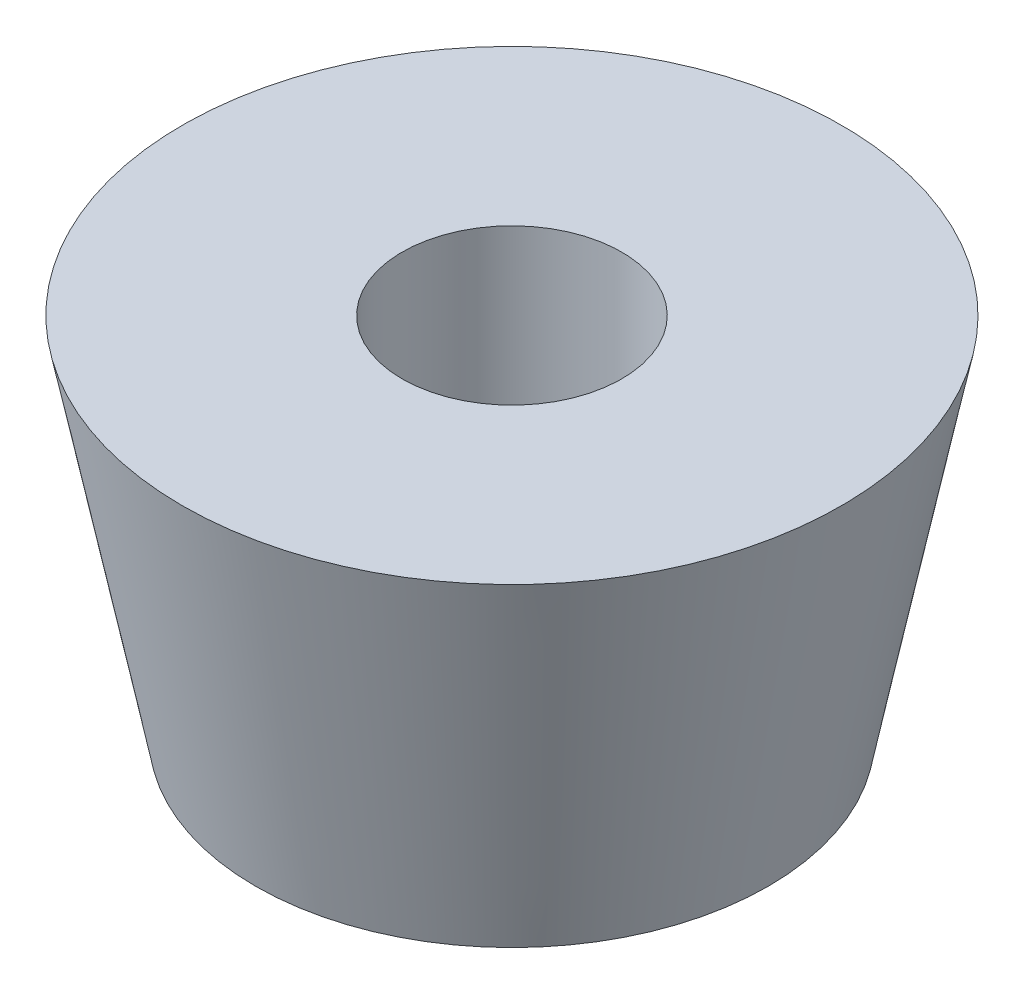
ISO-10303-21;
HEADER;
FILE_DESCRIPTION(('STEP AP214'),'2;1');
FILE_NAME('part.step','',(''),(''),'','','');
FILE_SCHEMA(('AUTOMOTIVE_DESIGN { 1 0 10303 214 1 1 1 1 }'));
ENDSEC;
DATA;
#1=APPLICATION_CONTEXT('core data for automotive mechanical design processes');
#2=APPLICATION_PROTOCOL_DEFINITION('international standard','automotive_design',2000,#1);
#3=PRODUCT_CONTEXT('',#1,'mechanical');
#4=PRODUCT('Part','Part','',(#3));
#5=PRODUCT_RELATED_PRODUCT_CATEGORY('part','',(#4));
#6=PRODUCT_DEFINITION_FORMATION('','',#4);
#7=PRODUCT_DEFINITION_CONTEXT('part definition',#1,'design');
#8=PRODUCT_DEFINITION('design','',#6,#7);
#9=PRODUCT_DEFINITION_SHAPE('','',#8);
#10=(LENGTH_UNIT() NAMED_UNIT(*) SI_UNIT(.MILLI.,.METRE.));
#11=(NAMED_UNIT(*) PLANE_ANGLE_UNIT() SI_UNIT($,.RADIAN.));
#12=(NAMED_UNIT(*) SI_UNIT($,.STERADIAN.) SOLID_ANGLE_UNIT());
#13=UNCERTAINTY_MEASURE_WITH_UNIT(LENGTH_MEASURE(1.E-05),#10,'distance_accuracy_value','');
#14=(GEOMETRIC_REPRESENTATION_CONTEXT(3) GLOBAL_UNCERTAINTY_ASSIGNED_CONTEXT((#13)) GLOBAL_UNIT_ASSIGNED_CONTEXT((#10,
#11,#12)) REPRESENTATION_CONTEXT('',''));
#15=CARTESIAN_POINT('',(0.,0.,0.));
#16=DIRECTION('',(0.,0.,1.));
#17=DIRECTION('',(1.,0.,0.));
#18=AXIS2_PLACEMENT_3D('',#15,#16,#17);
#19=CARTESIAN_POINT('',(0.,0.,-4.5));
#20=DIRECTION('',(0.,-1.,0.));
#21=DIRECTION('',(0.,0.,-1.));
#22=AXIS2_PLACEMENT_3D('',#19,#20,#21);
#23=PLANE('',#22);
#24=CARTESIAN_POINT('',(0.,0.,0.));
#25=DIRECTION('',(0.,1.,0.));
#26=DIRECTION('',(0.,0.,1.));
#27=AXIS2_PLACEMENT_3D('',#24,#25,#26);
#28=CIRCLE('',#27,1.5);
#29=CARTESIAN_POINT('',(0.,0.,1.5));
#30=VERTEX_POINT('',#29);
#31=EDGE_CURVE('E10',#30,#30,#28,.T.);
#32=ORIENTED_EDGE('',*,*,#31,.F.);
#33=EDGE_LOOP('',(#32));
#34=FACE_BOUND('',#33,.T.);
#35=CARTESIAN_POINT('',(0.,0.,0.));
#36=DIRECTION('',(0.,1.,0.));
#37=DIRECTION('',(0.,0.,1.));
#38=AXIS2_PLACEMENT_3D('',#35,#36,#37);
#39=CIRCLE('',#38,4.5);
#40=CARTESIAN_POINT('',(0.,0.,4.5));
#41=VERTEX_POINT('',#40);
#42=EDGE_CURVE('E45',#41,#41,#39,.T.);
#43=ORIENTED_EDGE('',*,*,#42,.T.);
#44=EDGE_LOOP('',(#43));
#45=FACE_BOUND('',#44,.T.);
#46=ADVANCED_FACE('F31',(#34,#45),#23,.F.);
#47=CARTESIAN_POINT('',(0.,0.,0.));
#48=DIRECTION('',(0.,1.,0.));
#49=DIRECTION('',(0.,0.,1.));
#50=AXIS2_PLACEMENT_3D('',#47,#48,#49);
#51=CYLINDRICAL_SURFACE('',#50,1.5);
#52=CARTESIAN_POINT('',(0.,-5.,0.));
#53=DIRECTION('',(0.,1.,0.));
#54=DIRECTION('',(0.,0.,1.));
#55=AXIS2_PLACEMENT_3D('',#52,#53,#54);
#56=CIRCLE('',#55,1.5);
#57=CARTESIAN_POINT('',(0.,-5.,1.5));
#58=VERTEX_POINT('',#57);
#59=EDGE_CURVE('E37',#58,#58,#56,.T.);
#60=ORIENTED_EDGE('',*,*,#59,.F.);
#61=EDGE_LOOP('',(#60));
#62=FACE_BOUND('',#61,.T.);
#63=ORIENTED_EDGE('',*,*,#31,.T.);
#64=EDGE_LOOP('',(#63));
#65=FACE_BOUND('',#64,.T.);
#66=ADVANCED_FACE('F60',(#62,#65),#51,.F.);
#67=CARTESIAN_POINT('',(0.,-5.,-1.5));
#68=DIRECTION('',(0.,1.,0.));
#69=DIRECTION('',(0.,0.,1.));
#70=AXIS2_PLACEMENT_3D('',#67,#68,#69);
#71=PLANE('',#70);
#72=CARTESIAN_POINT('',(0.,-5.,0.));
#73=DIRECTION('',(0.,1.,0.));
#74=DIRECTION('',(0.,0.,1.));
#75=AXIS2_PLACEMENT_3D('',#72,#73,#74);
#76=CIRCLE('',#75,3.5);
#77=CARTESIAN_POINT('',(0.,-5.,3.5));
#78=VERTEX_POINT('',#77);
#79=EDGE_CURVE('E41',#78,#78,#76,.T.);
#80=ORIENTED_EDGE('',*,*,#79,.F.);
#81=EDGE_LOOP('',(#80));
#82=FACE_BOUND('',#81,.T.);
#83=ORIENTED_EDGE('',*,*,#59,.T.);
#84=EDGE_LOOP('',(#83));
#85=FACE_BOUND('',#84,.T.);
#86=ADVANCED_FACE('F55',(#82,#85),#71,.F.);
#87=CARTESIAN_POINT('',(0.,-5.,0.));
#88=DIRECTION('',(0.,1.,0.));
#89=DIRECTION('',(0.,0.,1.));
#90=AXIS2_PLACEMENT_3D('',#87,#88,#89);
#91=CONICAL_SURFACE('',#90,3.5,0.197395559849881);
#92=ORIENTED_EDGE('',*,*,#42,.F.);
#93=EDGE_LOOP('',(#92));
#94=FACE_BOUND('',#93,.T.);
#95=ORIENTED_EDGE('',*,*,#79,.T.);
#96=EDGE_LOOP('',(#95));
#97=FACE_BOUND('',#96,.T.);
#98=ADVANCED_FACE('F52',(#94,#97),#91,.T.);
#99=CLOSED_SHELL('',(#46,#66,#86,#98));
#100=MANIFOLD_SOLID_BREP('B2',#99);
#101=ADVANCED_BREP_SHAPE_REPRESENTATION('',(#18,#100),#14);
#102=SHAPE_DEFINITION_REPRESENTATION(#9,#101);
ENDSEC;
END-ISO-10303-21;
